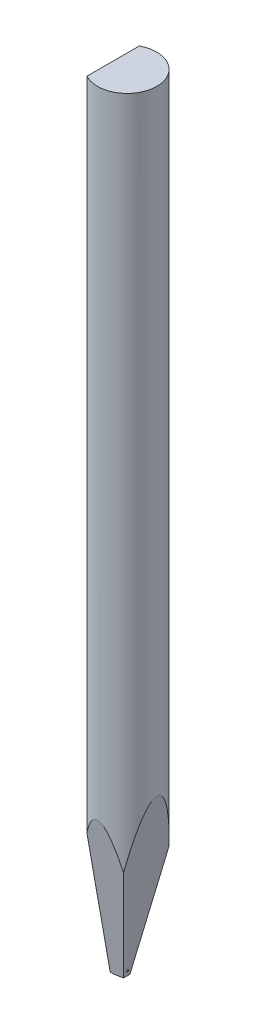
ISO-10303-21;
HEADER;
FILE_DESCRIPTION(('STEP AP214'),'2;1');
FILE_NAME('part.step','',(''),(''),'','','');
FILE_SCHEMA(('AUTOMOTIVE_DESIGN { 1 0 10303 214 1 1 1 1 }'));
ENDSEC;
DATA;
#1=APPLICATION_CONTEXT('core data for automotive mechanical design processes');
#2=APPLICATION_PROTOCOL_DEFINITION('international standard','automotive_design',2000,#1);
#3=PRODUCT_CONTEXT('',#1,'mechanical');
#4=PRODUCT('Part','Part','',(#3));
#5=PRODUCT_RELATED_PRODUCT_CATEGORY('part','',(#4));
#6=PRODUCT_DEFINITION_FORMATION('','',#4);
#7=PRODUCT_DEFINITION_CONTEXT('part definition',#1,'design');
#8=PRODUCT_DEFINITION('design','',#6,#7);
#9=PRODUCT_DEFINITION_SHAPE('','',#8);
#10=(LENGTH_UNIT() NAMED_UNIT(*) SI_UNIT(.MILLI.,.METRE.));
#11=(NAMED_UNIT(*) PLANE_ANGLE_UNIT() SI_UNIT($,.RADIAN.));
#12=(NAMED_UNIT(*) SI_UNIT($,.STERADIAN.) SOLID_ANGLE_UNIT());
#13=UNCERTAINTY_MEASURE_WITH_UNIT(LENGTH_MEASURE(1.E-05),#10,'distance_accuracy_value','');
#14=(GEOMETRIC_REPRESENTATION_CONTEXT(3) GLOBAL_UNCERTAINTY_ASSIGNED_CONTEXT((#13)) GLOBAL_UNIT_ASSIGNED_CONTEXT((#10,
#11,#12)) REPRESENTATION_CONTEXT('',''));
#15=CARTESIAN_POINT('',(0.,0.,0.));
#16=DIRECTION('',(0.,0.,1.));
#17=DIRECTION('',(1.,0.,0.));
#18=AXIS2_PLACEMENT_3D('',#15,#16,#17);
#19=CARTESIAN_POINT('',(0.,0.,0.));
#20=DIRECTION('',(0.,1.,0.));
#21=DIRECTION('',(0.,0.,1.));
#22=AXIS2_PLACEMENT_3D('',#19,#20,#21);
#23=PLANE('',#22);
#24=DIRECTION('',(-1.,0.,0.));
#25=VECTOR('',#24,1.);
#26=CARTESIAN_POINT('',(26.7786219491216,0.,0.0305592719154106));
#27=LINE('',#26,#25);
#28=CARTESIAN_POINT('',(-0.317710360796309,0.,0.0305770328086754));
#29=VERTEX_POINT('',#28);
#30=CARTESIAN_POINT('',(-0.375919999999998,0.,0.0305592719154106));
#31=VERTEX_POINT('',#30);
#32=EDGE_CURVE('E170',#29,#31,#27,.T.);
#33=ORIENTED_EDGE('',*,*,#32,.F.);
#34=CARTESIAN_POINT('',(-0.29972000002033,-1.74726357206605E-13,0.0322807752025751));
#35=CARTESIAN_POINT('',(-0.300686407289978,1.24223762482002E-08,0.0322152859431733));
#36=CARTESIAN_POINT('',(-0.301651821540009,9.7018723529701E-07,0.0321369955428288));
#37=CARTESIAN_POINT('',(-0.30351131031156,3.62214230492226E-06,0.0319666277855502));
#38=CARTESIAN_POINT('',(-0.304405511996895,5.25828560346504E-06,0.0318759506449385));
#39=CARTESIAN_POINT('',(-0.306127717271468,8.29289943810084E-06,0.0316886354981823));
#40=CARTESIAN_POINT('',(-0.306955822256389,9.70000125446796E-06,0.0315929056194708));
#41=CARTESIAN_POINT('',(-0.308550777856734,1.17772221327017E-05,0.0314033320937109));
#42=CARTESIAN_POINT('',(-0.309317674036299,1.24937582165023E-05,0.0313098635346038));
#43=CARTESIAN_POINT('',(-0.310794720526242,1.3053439983054E-05,0.0311320300678206));
#44=CARTESIAN_POINT('',(-0.311504850449402,1.29575626239236E-05,0.0310475049989768));
#45=CARTESIAN_POINT('',(-0.312872338996876,1.20754054263439E-05,0.0308945557940236));
#46=CARTESIAN_POINT('',(-0.313529614373576,1.13420495449805E-05,0.030825396668933));
#47=CARTESIAN_POINT('',(-0.314794854379422,9.57631192832601E-06,0.0307094686916388));
#48=CARTESIAN_POINT('',(-0.315402684866468,8.57157184484339E-06,0.0306613782169008));
#49=CARTESIAN_POINT('',(-0.316571417654933,6.9939604335059E-06,0.0305949486246632));
#50=CARTESIAN_POINT('',(-0.317132208614356,6.39310305501187E-06,0.0305745479993135));
#51=CARTESIAN_POINT('',(-0.317693589841151,6.21334656415781E-06,0.0305702414068889));
#52=B_SPLINE_CURVE_WITH_KNOTS('',3,(#34,#35,#36,#37,#38,#39,#40,#41,#42,#43,#44,#45,#46,#47,#48,
#49,#50,#51),.UNSPECIFIED.,.F.,.F.,(4,2,2,2,2,2,2,2,4),(0.,0.00290561022115357,
0.00560181967612335,0.0081026466662088,0.0104203684999723,0.0125657636721677,0.0145484144140113,
0.0163771098843251,0.0180604059657814),.UNSPECIFIED.);
#53=CARTESIAN_POINT('',(-0.29972,0.,0.032280775210277));
#54=VERTEX_POINT('',#53);
#55=EDGE_CURVE('E172',#29,#54,#52,.F.);
#56=ORIENTED_EDGE('',*,*,#55,.T.);
#57=DIRECTION('',(0.,0.,-1.));
#58=VECTOR('',#57,1.);
#59=CARTESIAN_POINT('',(-0.29972,0.,27.2760283406468));
#60=LINE('',#59,#58);
#61=CARTESIAN_POINT('',(-0.299719999999993,0.,0.0762000000000001));
#62=VERTEX_POINT('',#61);
#63=EDGE_CURVE('E220',#62,#54,#60,.T.);
#64=ORIENTED_EDGE('',*,*,#63,.F.);
#65=DIRECTION('',(-1.,0.,0.));
#66=VECTOR('',#65,1.);
#67=CARTESIAN_POINT('',(26.8738719491216,0.,0.0762));
#68=LINE('',#67,#66);
#69=CARTESIAN_POINT('',(-0.375919999999998,0.,0.0762));
#70=VERTEX_POINT('',#69);
#71=EDGE_CURVE('E240',#62,#70,#68,.T.);
#72=ORIENTED_EDGE('',*,*,#71,.T.);
#73=DIRECTION('',(0.,0.,1.));
#74=VECTOR('',#73,1.);
#75=CARTESIAN_POINT('',(-0.37592,0.,0.));
#76=LINE('',#75,#74);
#77=EDGE_CURVE('E186',#31,#70,#76,.T.);
#78=ORIENTED_EDGE('',*,*,#77,.F.);
#79=EDGE_LOOP('',(#33,#56,#64,#72,#78));
#80=FACE_BOUND('',#79,.T.);
#81=ADVANCED_FACE('F45',(#80),#23,.F.);
#82=CARTESIAN_POINT('',(-0.29972,0.,-0.032278111075059));
#83=VERTEX_POINT('',#82);
#84=CARTESIAN_POINT('',(-0.299719999999993,0.,-0.0762000000000001));
#85=VERTEX_POINT('',#84);
#86=EDGE_CURVE('E225',#83,#85,#60,.T.);
#87=ORIENTED_EDGE('',*,*,#86,.F.);
#88=CARTESIAN_POINT('',(-0.317682511652513,6.43790428013726E-06,-0.030570613507464));
#89=CARTESIAN_POINT('',(-0.317121273851713,6.6174722265185E-06,-0.0305750601274098));
#90=CARTESIAN_POINT('',(-0.316560631451084,7.18813768573643E-06,-0.0305955857376526));
#91=CARTESIAN_POINT('',(-0.315391703606004,8.67399681592602E-06,-0.0306622289088094));
#92=CARTESIAN_POINT('',(-0.314783530685761,9.61491344262969E-06,-0.0307104237525561));
#93=CARTESIAN_POINT('',(-0.313517269904021,1.12547805020148E-05,-0.0308264650915119));
#94=CARTESIAN_POINT('',(-0.312859315988159,1.19264963525961E-05,-0.0308956300361787));
#95=CARTESIAN_POINT('',(-0.311490375327924,1.27073946710848E-05,-0.0310484783755905));
#96=CARTESIAN_POINT('',(-0.310779470598419,1.27658516769523E-05,-0.0311328875999629));
#97=CARTESIAN_POINT('',(-0.309301129508577,1.21650146399189E-05,-0.0313103678796936));
#98=CARTESIAN_POINT('',(-0.308533712640017,1.14480252757793E-05,-0.0314035923196854));
#99=CARTESIAN_POINT('',(-0.306938462102202,9.40248633924498E-06,-0.0315925755252677));
#100=CARTESIAN_POINT('',(-0.306110583728908,8.03060699328291E-06,-0.0316879650252507));
#101=CARTESIAN_POINT('',(-0.304390252743759,5.08254953581124E-06,-0.0318745569032146));
#102=CARTESIAN_POINT('',(-0.303497702434909,3.49877090696116E-06,-0.0319648815459051));
#103=CARTESIAN_POINT('',(-0.301643840636724,9.37653295759017E-07,-0.032134581646994));
#104=CARTESIAN_POINT('',(-0.300682408000462,1.49043844381255E-08,-0.0322126220809699));
#105=CARTESIAN_POINT('',(-0.299720000145215,-1.28192946059671E-13,-0.0322781112703166));
#106=B_SPLINE_CURVE_WITH_KNOTS('',3,(#88,#89,#90,#91,#92,#93,#94,#95,#96,#97,#98,#99,#100,#101,
#102,#103,#104,#105),.UNSPECIFIED.,.F.,.F.,(4,2,2,2,2,2,2,2,4),(0.,0.00168286779229302,
0.00351261455278365,0.00549729447393092,0.00764495741405796,0.00996414130010328,
0.0124641762366295,0.015155354305918,0.0180490028825687),.UNSPECIFIED.);
#107=CARTESIAN_POINT('',(-0.317699619026821,0.,-0.0305592719154106));
#108=VERTEX_POINT('',#107);
#109=EDGE_CURVE('E75',#83,#108,#106,.F.);
#110=ORIENTED_EDGE('',*,*,#109,.T.);
#111=DIRECTION('',(-1.,0.,0.));
#112=VECTOR('',#111,1.);
#113=CARTESIAN_POINT('',(26.7786219491216,0.,-0.0305592719154106));
#114=LINE('',#113,#112);
#115=CARTESIAN_POINT('',(-0.375919999999998,0.,-0.0305592719154106));
#116=VERTEX_POINT('',#115);
#117=EDGE_CURVE('E169',#108,#116,#114,.T.);
#118=ORIENTED_EDGE('',*,*,#117,.T.);
#119=CARTESIAN_POINT('',(-0.37592,0.,-0.0762000000000005));
#120=VERTEX_POINT('',#119);
#121=EDGE_CURVE('E178',#120,#116,#76,.T.);
#122=ORIENTED_EDGE('',*,*,#121,.F.);
#123=DIRECTION('',(-1.,0.,0.));
#124=VECTOR('',#123,1.);
#125=CARTESIAN_POINT('',(26.8738719491216,0.,-0.0762));
#126=LINE('',#125,#124);
#127=EDGE_CURVE('E243',#85,#120,#126,.T.);
#128=ORIENTED_EDGE('',*,*,#127,.F.);
#129=EDGE_LOOP('',(#87,#110,#118,#122,#128));
#130=FACE_BOUND('',#129,.T.);
#131=ADVANCED_FACE('F176',(#130),#23,.F.);
#132=CARTESIAN_POINT('',(-0.29972,0.,27.2760283406468));
#133=DIRECTION('',(-0.173648177666931,0.984807753012208,0.));
#134=DIRECTION('',(-0.984807753012208,-0.173648177666931,0.));
#135=AXIS2_PLACEMENT_3D('',#132,#133,#134);
#136=PLANE('',#135);
#137=DIRECTION('',(-0.984807753012208,-0.173648177666931,0.));
#138=VECTOR('',#137,1.);
#139=CARTESIAN_POINT('',(-0.29972,0.,-0.0190499999999996));
#140=LINE('',#139,#138);
#141=CARTESIAN_POINT('',(-0.1397,0.0282158434529687,-0.0190499999999998));
#142=VERTEX_POINT('',#141);
#143=CARTESIAN_POINT('',(-0.172308434913934,0.0224660965789663,-0.01905));
#144=VERTEX_POINT('',#143);
#145=EDGE_CURVE('E206',#142,#144,#140,.T.);
#146=ORIENTED_EDGE('',*,*,#145,.T.);
#147=CARTESIAN_POINT('',(-0.172308434913934,0.0224660965789663,-0.04445));
#148=DIRECTION('',(-0.173648177666931,0.984807753012208,0.));
#149=DIRECTION('',(-0.984807753012208,-0.173648177666931,0.));
#150=AXIS2_PLACEMENT_3D('',#147,#148,#149);
#151=ELLIPSE('',#150,0.146272770271847,0.0254);
#152=CARTESIAN_POINT('',(-0.290152127752212,0.00168707402525674,-0.0298420493686051));
#153=VERTEX_POINT('',#152);
#154=EDGE_CURVE('E383',#144,#153,#151,.F.);
#155=ORIENTED_EDGE('',*,*,#154,.T.);
#156=CARTESIAN_POINT('',(-0.299720000129434,-2.28226443167289E-11,-0.0322781113175099));
#157=CARTESIAN_POINT('',(-0.299306160257967,4.4993723494889E-05,-0.0322150037200581));
#158=CARTESIAN_POINT('',(-0.298893426590026,9.30259749901382E-05,-0.0321467991132638));
#159=CARTESIAN_POINT('',(-0.298071445006129,0.000195204853066265,-0.0320004874666544));
#160=CARTESIAN_POINT('',(-0.297662191361852,0.000249337576544469,-0.0319224028955109));
#161=CARTESIAN_POINT('',(-0.296847443987139,0.000363834584556914,-0.0317565134529267));
#162=CARTESIAN_POINT('',(-0.296441944180107,0.000424185589633815,-0.0316687292676122));
#163=CARTESIAN_POINT('',(-0.295634969723986,0.000551243306116202,-0.0314836230901761));
#164=CARTESIAN_POINT('',(-0.295233488831756,0.000617937566250923,-0.0313863197729815));
#165=CARTESIAN_POINT('',(-0.294434807056674,0.000757812171341388,-0.0311823559027142));
#166=CARTESIAN_POINT('',(-0.294037599988075,0.000830981135403096,-0.0310757117716665));
#167=CARTESIAN_POINT('',(-0.29324771030769,0.000983942275247106,-0.0308532463080567));
#168=CARTESIAN_POINT('',(-0.292855021835243,0.0010637244178342,-0.0307374388892935));
#169=CARTESIAN_POINT('',(-0.292074402965838,0.00123005638345297,-0.0304968248930324));
#170=CARTESIAN_POINT('',(-0.291686467349433,0.001316597832869,-0.0303720294646064));
#171=CARTESIAN_POINT('',(-0.290915576771095,0.00149659903366281,-0.0301136222011364));
#172=CARTESIAN_POINT('',(-0.290532617598061,0.00159005241779613,-0.0299800184922692));
#173=CARTESIAN_POINT('',(-0.290152147836756,0.00168707325331096,-0.0298420504644946));
#174=B_SPLINE_CURVE_WITH_KNOTS('',3,(#156,#157,#158,#159,#160,#161,#162,#163,#164,#165,#166,
#167,#168,#169,#170,#171,#172,#173),.UNSPECIFIED.,.F.,.F.,(4,2,2,2,2,2,2,2,4),(0.,
0.00126306370365663,0.00252330495037774,0.00378090857781648,0.00503609267401743,
0.0062891127100991,0.0075402653493693,0.00878989188831975,0.0100383812804196),.UNSPECIFIED.);
#175=EDGE_CURVE('E274',#153,#83,#174,.F.);
#176=ORIENTED_EDGE('',*,*,#175,.T.);
#177=ORIENTED_EDGE('',*,*,#86,.T.);
#178=DIRECTION('',(0.984346441568213,0.173566836012845,-0.0306045161452665));
#179=VECTOR('',#178,1.);
#180=CARTESIAN_POINT('',(26.0298035813508,4.64260539659194,-0.894816592201888));
#181=LINE('',#180,#179);
#182=CARTESIAN_POINT('',(-0.0113543651851166,0.0508466417269886,-0.0851656348148851));
#183=VERTEX_POINT('',#182);
#184=EDGE_CURVE('E203',#85,#183,#181,.T.);
#185=ORIENTED_EDGE('',*,*,#184,.T.);
#186=DIRECTION('',(0.,0.,-1.));
#187=VECTOR('',#186,1.);
#188=CARTESIAN_POINT('',(-0.0113543651851151,0.0508466417269888,27.2760283406468));
#189=LINE('',#188,#187);
#190=CARTESIAN_POINT('',(-0.0113543651851166,0.0508466417269886,0.0851656348148851));
#191=VERTEX_POINT('',#190);
#192=EDGE_CURVE('E210',#191,#183,#189,.T.);
#193=ORIENTED_EDGE('',*,*,#192,.F.);
#194=DIRECTION('',(-0.984346441568213,-0.173566836012845,-0.0306045161452665));
#195=VECTOR('',#194,1.);
#196=CARTESIAN_POINT('',(26.0298035813508,4.64260539659194,0.894816592201888));
#197=LINE('',#196,#195);
#198=EDGE_CURVE('E237',#191,#62,#197,.T.);
#199=ORIENTED_EDGE('',*,*,#198,.T.);
#200=ORIENTED_EDGE('',*,*,#63,.T.);
#201=CARTESIAN_POINT('',(-0.290152147836355,0.00168707325874013,0.0298420504567719));
#202=CARTESIAN_POINT('',(-0.290534992923029,0.00159019384761207,0.0299798653538116));
#203=CARTESIAN_POINT('',(-0.29092025077928,0.00149680270494308,0.0301134265394838));
#204=CARTESIAN_POINT('',(-0.291695023548512,0.0013169325559799,0.0303717426179296));
#205=CARTESIAN_POINT('',(-0.292084535632163,0.00123044924002008,0.0304965029955968));
#206=CARTESIAN_POINT('',(-0.292867624137279,0.00106423142417858,0.0307370597268938));
#207=CARTESIAN_POINT('',(-0.293261199424063,0.00098449509444579,0.0308528585102666));
#208=CARTESIAN_POINT('',(-0.294052210187191,0.000831615269792872,0.0310753383402063));
#209=CARTESIAN_POINT('',(-0.294449645853234,0.000758472100692954,0.0311820189361579));
#210=CARTESIAN_POINT('',(-0.29524816357304,0.000618631412626729,0.0313861063147916));
#211=CARTESIAN_POINT('',(-0.295649246812102,0.000551936077230667,0.031483509955652));
#212=CARTESIAN_POINT('',(-0.296454836112643,0.000424851798958048,0.0316688863771004));
#213=CARTESIAN_POINT('',(-0.296859344067208,0.000364466628744461,0.0317568535167056));
#214=CARTESIAN_POINT('',(-0.297671549888011,0.000249870909783037,0.0319231974706844));
#215=CARTESIAN_POINT('',(-0.298079250105948,0.000195665484613924,0.0320015663311409));
#216=CARTESIAN_POINT('',(-0.298897598493603,9.33049104979823E-05,0.0321485545545423));
#217=CARTESIAN_POINT('',(-0.299308249259817,4.51560293286562E-05,0.0322171638269661));
#218=CARTESIAN_POINT('',(-0.299720000023017,-4.05862035810058E-12,0.0322807752102771));
#219=B_SPLINE_CURVE_WITH_KNOTS('',3,(#201,#202,#203,#204,#205,#206,#207,#208,#209,#210,#211,
#212,#213,#214,#215,#216,#217,#218),.UNSPECIFIED.,.F.,.F.,(4,2,2,2,2,2,2,2,4),(0.,
0.00125476226502894,0.00250873549119815,0.00376236752971127,0.00501606148617273,
0.00627017853188946,0.00752504113849814,0.00878093668996702,0.0100381214289372),.UNSPECIFIED.);
#220=CARTESIAN_POINT('',(-0.290152127709106,0.00168707403285748,0.0298420493552373));
#221=VERTEX_POINT('',#220);
#222=EDGE_CURVE('E219',#54,#221,#219,.F.);
#223=ORIENTED_EDGE('',*,*,#222,.T.);
#224=CARTESIAN_POINT('',(-0.172308434913934,0.0224660965789663,0.04445));
#225=DIRECTION('',(-0.173648177666931,0.984807753012208,0.));
#226=DIRECTION('',(-0.984807753012208,-0.173648177666931,0.));
#227=AXIS2_PLACEMENT_3D('',#224,#225,#226);
#228=ELLIPSE('',#227,0.146272770271847,0.0254);
#229=CARTESIAN_POINT('',(-0.172308434913934,0.0224660965789663,0.0190499999999998));
#230=VERTEX_POINT('',#229);
#231=EDGE_CURVE('E392',#221,#230,#228,.F.);
#232=ORIENTED_EDGE('',*,*,#231,.T.);
#233=DIRECTION('',(-0.984807753012208,-0.173648177666931,0.));
#234=VECTOR('',#233,1.);
#235=CARTESIAN_POINT('',(-0.29972,0.,0.0190499999999996));
#236=LINE('',#235,#234);
#237=CARTESIAN_POINT('',(-0.1397,0.0282158434529687,0.0190499999999998));
#238=VERTEX_POINT('',#237);
#239=EDGE_CURVE('E216',#238,#230,#236,.T.);
#240=ORIENTED_EDGE('',*,*,#239,.F.);
#241=DIRECTION('',(0.,0.,1.));
#242=VECTOR('',#241,1.);
#243=CARTESIAN_POINT('',(-0.1397,0.0282158434529687,27.2760283406468));
#244=LINE('',#243,#242);
#245=EDGE_CURVE('E214',#142,#238,#244,.T.);
#246=ORIENTED_EDGE('',*,*,#245,.F.);
#247=EDGE_LOOP('',(#146,#155,#176,#177,#185,#193,#199,#200,#223,#232,#240,#246));
#248=FACE_BOUND('',#247,.T.);
#249=ADVANCED_FACE('F416',(#248),#136,.F.);
#250=CARTESIAN_POINT('',(0.,21.0312,0.));
#251=DIRECTION('',(0.,-1.,0.));
#252=DIRECTION('',(0.,0.,-1.));
#253=AXIS2_PLACEMENT_3D('',#250,#251,#252);
#254=CYLINDRICAL_SURFACE('',#253,0.792479999999998);
#255=CARTESIAN_POINT('',(0.,-0.432151674654869,0.));
#256=DIRECTION('',(0.,-0.173648177666931,0.984807753012208));
#257=DIRECTION('',(0.,-0.984807753012208,-0.173648177666931));
#258=AXIS2_PLACEMENT_3D('',#255,#256,#257);
#259=ELLIPSE('',#258,4.56371043248163,0.792479999999998);
#260=CARTESIAN_POINT('',(0.510025990868476,3.00774157611953,0.606545990868479));
#261=VERTEX_POINT('',#260);
#262=CARTESIAN_POINT('',(-0.37592,3.52439037249585,0.69764511322018));
#263=VERTEX_POINT('',#262);
#264=EDGE_CURVE('E245',#261,#263,#259,.T.);
#265=ORIENTED_EDGE('',*,*,#264,.F.);
#266=CARTESIAN_POINT('',(0.,0.115240446574631,0.));
#267=DIRECTION('',(-0.984807753012208,0.173648177666931,0.));
#268=DIRECTION('',(-0.173648177666931,-0.984807753012208,0.));
#269=AXIS2_PLACEMENT_3D('',#266,#267,#268);
#270=ELLIPSE('',#269,4.56371043248165,0.792479999999998);
#271=CARTESIAN_POINT('',(0.510025990868476,3.00774157611953,-0.606545990868479));
#272=VERTEX_POINT('',#271);
#273=EDGE_CURVE('E224',#261,#272,#270,.T.);
#274=ORIENTED_EDGE('',*,*,#273,.T.);
#275=CARTESIAN_POINT('',(0.,-0.432151674654869,0.));
#276=DIRECTION('',(0.,-0.173648177666931,-0.984807753012208));
#277=DIRECTION('',(0.,-0.984807753012208,0.173648177666931));
#278=AXIS2_PLACEMENT_3D('',#275,#276,#277);
#279=ELLIPSE('',#278,4.56371043248163,0.792479999999998);
#280=CARTESIAN_POINT('',(-0.37592,3.52439037249585,-0.69764511322018));
#281=VERTEX_POINT('',#280);
#282=EDGE_CURVE('E247',#281,#272,#279,.T.);
#283=ORIENTED_EDGE('',*,*,#282,.F.);
#284=DIRECTION('',(0.,-1.,0.));
#285=VECTOR('',#284,1.);
#286=CARTESIAN_POINT('',(-0.37592,21.0312,-0.69764511322018));
#287=LINE('',#286,#285);
#288=CARTESIAN_POINT('',(-0.37592,21.0312,-0.69764511322018));
#289=VERTEX_POINT('',#288);
#290=EDGE_CURVE('E252',#289,#281,#287,.T.);
#291=ORIENTED_EDGE('',*,*,#290,.F.);
#292=CARTESIAN_POINT('',(0.,21.0312,0.));
#293=DIRECTION('',(0.,1.,0.));
#294=DIRECTION('',(0.,0.,1.));
#295=AXIS2_PLACEMENT_3D('',#292,#293,#294);
#296=CIRCLE('',#295,0.792479999999998);
#297=CARTESIAN_POINT('',(-0.37592,21.0312,0.69764511322018));
#298=VERTEX_POINT('',#297);
#299=EDGE_CURVE('E190',#298,#289,#296,.T.);
#300=ORIENTED_EDGE('',*,*,#299,.F.);
#301=DIRECTION('',(0.,-1.,0.));
#302=VECTOR('',#301,1.);
#303=CARTESIAN_POINT('',(-0.37592,21.0312,0.69764511322018));
#304=LINE('',#303,#302);
#305=EDGE_CURVE('E251',#263,#298,#304,.F.);
#306=ORIENTED_EDGE('',*,*,#305,.F.);
#307=EDGE_LOOP('',(#265,#274,#283,#291,#300,#306));
#308=FACE_BOUND('',#307,.T.);
#309=ADVANCED_FACE('F262',(#308),#254,.T.);
#310=CARTESIAN_POINT('',(-0.37592,21.0312,-0.80247998));
#311=DIRECTION('',(-1.,0.,0.));
#312=DIRECTION('',(0.,0.,1.));
#313=AXIS2_PLACEMENT_3D('',#310,#311,#312);
#314=PLANE('',#313);
#315=ORIENTED_EDGE('',*,*,#121,.T.);
#316=CARTESIAN_POINT('',(-0.37592,0.,0.0305592719154106));
#317=CARTESIAN_POINT('',(-0.37592,0.0146958072941779,0.023773050294587));
#318=CARTESIAN_POINT('',(-0.37592,0.0292100000000017,0.0123620164096919));
#319=CARTESIAN_POINT('',(-0.37592,0.0292100000000017,-0.0123620164096919));
#320=CARTESIAN_POINT('',(-0.37592,0.014695807294178,-0.0237730502945872));
#321=CARTESIAN_POINT('',(-0.37592,0.,-0.0305592719154106));
#322=(BOUNDED_CURVE() B_SPLINE_CURVE(3,(#316,#317,#318,#319,#320,#321),.UNSPECIFIED.,.F.,
.F.) B_SPLINE_CURVE_WITH_KNOTS((4,2,4),(1.32272489561682,1.5707963267949,1.81886775797297),
.UNSPECIFIED.) CURVE() GEOMETRIC_REPRESENTATION_ITEM() RATIONAL_B_SPLINE_CURVE((1.,1.,1.,1.,1.,1.)) REPRESENTATION_ITEM(''));
#323=EDGE_CURVE('E12',#116,#31,#322,.F.);
#324=ORIENTED_EDGE('',*,*,#323,.T.);
#325=ORIENTED_EDGE('',*,*,#77,.T.);
#326=DIRECTION('',(0.,0.984807753012208,0.173648177666931));
#327=VECTOR('',#326,1.);
#328=CARTESIAN_POINT('',(-0.37592,20.2467685967878,3.64625157577457));
#329=LINE('',#328,#327);
#330=EDGE_CURVE('E185',#70,#263,#329,.T.);
#331=ORIENTED_EDGE('',*,*,#330,.T.);
#332=ORIENTED_EDGE('',*,*,#305,.T.);
#333=DIRECTION('',(0.,0.,-1.));
#334=VECTOR('',#333,1.);
#335=CARTESIAN_POINT('',(-0.37592,21.0312,-0.80247998));
#336=LINE('',#335,#334);
#337=EDGE_CURVE('E249',#298,#289,#336,.T.);
#338=ORIENTED_EDGE('',*,*,#337,.T.);
#339=ORIENTED_EDGE('',*,*,#290,.T.);
#340=DIRECTION('',(0.,-0.984807753012208,0.173648177666931));
#341=VECTOR('',#340,1.);
#342=CARTESIAN_POINT('',(-0.37592,20.5212329145634,-3.69464704024015));
#343=LINE('',#342,#341);
#344=EDGE_CURVE('E184',#281,#120,#343,.T.);
#345=ORIENTED_EDGE('',*,*,#344,.T.);
#346=EDGE_LOOP('',(#315,#324,#325,#331,#332,#338,#339,#345));
#347=FACE_BOUND('',#346,.T.);
#348=ADVANCED_FACE('F182',(#347),#314,.T.);
#349=CARTESIAN_POINT('',(0.,21.0312,0.));
#350=DIRECTION('',(0.,1.,0.));
#351=DIRECTION('',(0.,0.,1.));
#352=AXIS2_PLACEMENT_3D('',#349,#350,#351);
#353=PLANE('',#352);
#354=ORIENTED_EDGE('',*,*,#299,.T.);
#355=ORIENTED_EDGE('',*,*,#337,.F.);
#356=EDGE_LOOP('',(#354,#355));
#357=FACE_BOUND('',#356,.T.);
#358=ADVANCED_FACE('F258',(#357),#353,.T.);
#359=CARTESIAN_POINT('',(26.8738719491216,0.,0.0762));
#360=DIRECTION('',(0.,-0.173648177666931,0.984807753012208));
#361=DIRECTION('',(0.,-0.984807753012208,-0.173648177666931));
#362=AXIS2_PLACEMENT_3D('',#359,#360,#361);
#363=PLANE('',#362);
#364=ORIENTED_EDGE('',*,*,#198,.F.);
#365=DIRECTION('',(-0.171087869746036,-0.970287525247814,-0.171087869746036));
#366=VECTOR('',#365,1.);
#367=CARTESIAN_POINT('',(0.766901483986011,4.46455489014234,0.863421483986016));
#368=LINE('',#367,#366);
#369=EDGE_CURVE('E234',#261,#191,#368,.T.);
#370=ORIENTED_EDGE('',*,*,#369,.F.);
#371=ORIENTED_EDGE('',*,*,#264,.T.);
#372=ORIENTED_EDGE('',*,*,#330,.F.);
#373=ORIENTED_EDGE('',*,*,#71,.F.);
#374=EDGE_LOOP('',(#364,#370,#371,#372,#373));
#375=FACE_BOUND('',#374,.T.);
#376=ADVANCED_FACE('F497',(#375),#363,.T.);
#377=CARTESIAN_POINT('',(26.8738719491216,0.,-0.0762));
#378=DIRECTION('',(0.,-0.173648177666931,-0.984807753012208));
#379=DIRECTION('',(0.,0.984807753012208,-0.173648177666931));
#380=AXIS2_PLACEMENT_3D('',#377,#378,#379);
#381=PLANE('',#380);
#382=ORIENTED_EDGE('',*,*,#184,.F.);
#383=ORIENTED_EDGE('',*,*,#127,.T.);
#384=ORIENTED_EDGE('',*,*,#344,.F.);
#385=ORIENTED_EDGE('',*,*,#282,.T.);
#386=DIRECTION('',(0.171087869746036,0.970287525247814,-0.171087869746036));
#387=VECTOR('',#386,1.);
#388=CARTESIAN_POINT('',(0.766901483986011,4.46455489014234,-0.863421483986016));
#389=LINE('',#388,#387);
#390=EDGE_CURVE('E200',#183,#272,#389,.T.);
#391=ORIENTED_EDGE('',*,*,#390,.F.);
#392=EDGE_LOOP('',(#382,#383,#384,#385,#391));
#393=FACE_BOUND('',#392,.T.);
#394=ADVANCED_FACE('F267',(#393),#381,.T.);
#395=CARTESIAN_POINT('',(-0.0113543651851151,0.0508466417269888,27.2760283406468));
#396=DIRECTION('',(-0.984807753012208,0.173648177666931,0.));
#397=DIRECTION('',(-0.173648177666931,-0.984807753012208,0.));
#398=AXIS2_PLACEMENT_3D('',#395,#396,#397);
#399=PLANE('',#398);
#400=CARTESIAN_POINT('',(0.0122922911853769,0.184953494095707,0.));
#401=DIRECTION('',(-0.984807753012208,0.173648177666931,0.));
#402=DIRECTION('',(0.173648177666931,0.984807753012208,0.));
#403=AXIS2_PLACEMENT_3D('',#400,#401,#402);
#404=ELLIPSE('',#403,0.0336182099567053,0.0252651922242437);
#405=CARTESIAN_POINT('',(0.0181300320807831,0.218060967903463,0.));
#406=VERTEX_POINT('',#405);
#407=EDGE_CURVE('E207',#406,#406,#404,.F.);
#408=ORIENTED_EDGE('',*,*,#407,.F.);
#409=EDGE_LOOP('',(#408));
#410=FACE_BOUND('',#409,.T.);
#411=ORIENTED_EDGE('',*,*,#273,.F.);
#412=ORIENTED_EDGE('',*,*,#369,.T.);
#413=ORIENTED_EDGE('',*,*,#192,.T.);
#414=ORIENTED_EDGE('',*,*,#390,.T.);
#415=EDGE_LOOP('',(#411,#412,#413,#414));
#416=FACE_BOUND('',#415,.T.);
#417=ADVANCED_FACE('F489',(#410,#416),#399,.F.);
#418=CARTESIAN_POINT('',(-0.1397,0.09144,0.01905));
#419=DIRECTION('',(-1.,0.,0.));
#420=DIRECTION('',(0.,-1.,0.));
#421=AXIS2_PLACEMENT_3D('',#418,#419,#420);
#422=PLANE('',#421);
#423=ORIENTED_EDGE('',*,*,#245,.T.);
#424=DIRECTION('',(0.,1.,0.));
#425=VECTOR('',#424,1.);
#426=CARTESIAN_POINT('',(-0.1397,0.09144,0.01905));
#427=LINE('',#426,#425);
#428=CARTESIAN_POINT('',(-0.1397,0.09144,0.01905));
#429=VERTEX_POINT('',#428);
#430=EDGE_CURVE('E444',#238,#429,#427,.T.);
#431=ORIENTED_EDGE('',*,*,#430,.T.);
#432=CARTESIAN_POINT('',(-0.1397,0.0914400000000001,0.));
#433=DIRECTION('',(1.,0.,0.));
#434=DIRECTION('',(0.,1.,0.));
#435=AXIS2_PLACEMENT_3D('',#432,#433,#434);
#436=ELLIPSE('',#435,0.0219970452561247,0.01905);
#437=CARTESIAN_POINT('',(-0.1397,0.09144,-0.0190499999999996));
#438=VERTEX_POINT('',#437);
#439=EDGE_CURVE('E437',#438,#429,#436,.F.);
#440=ORIENTED_EDGE('',*,*,#439,.F.);
#441=DIRECTION('',(0.,1.,0.));
#442=VECTOR('',#441,1.);
#443=CARTESIAN_POINT('',(-0.1397,0.09144,-0.01905));
#444=LINE('',#443,#442);
#445=EDGE_CURVE('E445',#142,#438,#444,.T.);
#446=ORIENTED_EDGE('',*,*,#445,.F.);
#447=EDGE_LOOP('',(#423,#431,#440,#446));
#448=FACE_BOUND('',#447,.T.);
#449=ADVANCED_FACE('F492',(#448),#422,.T.);
#450=CARTESIAN_POINT('',(0.,0.,0.01905));
#451=DIRECTION('',(0.,0.,-1.));
#452=DIRECTION('',(-1.,0.,0.));
#453=AXIS2_PLACEMENT_3D('',#450,#451,#452);
#454=PLANE('',#453);
#455=ORIENTED_EDGE('',*,*,#239,.T.);
#456=DIRECTION('',(1.,0.,0.));
#457=VECTOR('',#456,1.);
#458=CARTESIAN_POINT('',(-0.301769962417407,0.0224660965789663,0.01905));
#459=LINE('',#458,#457);
#460=CARTESIAN_POINT('',(-0.290152147836365,0.0224660965789732,0.01905));
#461=VERTEX_POINT('',#460);
#462=EDGE_CURVE('E390',#230,#461,#459,.F.);
#463=ORIENTED_EDGE('',*,*,#462,.T.);
#464=DIRECTION('',(-0.500000000000004,-0.866025403784436,0.));
#465=VECTOR('',#464,1.);
#466=CARTESIAN_POINT('',(-0.227342216057905,0.131256089639199,0.01905));
#467=LINE('',#466,#465);
#468=CARTESIAN_POINT('',(-0.250330046129175,0.09144,0.01905));
#469=VERTEX_POINT('',#468);
#470=EDGE_CURVE('E447',#469,#461,#467,.T.);
#471=ORIENTED_EDGE('',*,*,#470,.F.);
#472=DIRECTION('',(-1.,0.,0.));
#473=VECTOR('',#472,1.);
#474=CARTESIAN_POINT('',(-0.2723270913853,0.09144,0.01905));
#475=LINE('',#474,#473);
#476=EDGE_CURVE('E441',#429,#469,#475,.T.);
#477=ORIENTED_EDGE('',*,*,#476,.F.);
#478=ORIENTED_EDGE('',*,*,#430,.F.);
#479=EDGE_LOOP('',(#455,#463,#471,#477,#478));
#480=FACE_BOUND('',#479,.T.);
#481=ADVANCED_FACE('F609',(#480),#454,.T.);
#482=CARTESIAN_POINT('',(0.,0.,-0.01905));
#483=DIRECTION('',(0.,0.,-1.));
#484=DIRECTION('',(-1.,0.,0.));
#485=AXIS2_PLACEMENT_3D('',#482,#483,#484);
#486=PLANE('',#485);
#487=DIRECTION('',(0.500000000000004,0.866025403784436,0.));
#488=VECTOR('',#487,1.);
#489=CARTESIAN_POINT('',(-0.250330046129175,0.09144,-0.01905));
#490=LINE('',#489,#488);
#491=CARTESIAN_POINT('',(-0.290152147836481,0.0224660965787719,-0.01905));
#492=VERTEX_POINT('',#491);
#493=CARTESIAN_POINT('',(-0.250330046129175,0.09144,-0.01905));
#494=VERTEX_POINT('',#493);
#495=EDGE_CURVE('E458',#492,#494,#490,.T.);
#496=ORIENTED_EDGE('',*,*,#495,.F.);
#497=DIRECTION('',(-1.,0.,0.));
#498=VECTOR('',#497,1.);
#499=CARTESIAN_POINT('',(0.,0.0224660965789663,-0.01905));
#500=LINE('',#499,#498);
#501=EDGE_CURVE('E384',#492,#144,#500,.F.);
#502=ORIENTED_EDGE('',*,*,#501,.T.);
#503=ORIENTED_EDGE('',*,*,#145,.F.);
#504=ORIENTED_EDGE('',*,*,#445,.T.);
#505=DIRECTION('',(-1.,0.,0.));
#506=VECTOR('',#505,1.);
#507=CARTESIAN_POINT('',(-0.2723270913853,0.09144,-0.01905));
#508=LINE('',#507,#506);
#509=EDGE_CURVE('E440',#438,#494,#508,.T.);
#510=ORIENTED_EDGE('',*,*,#509,.T.);
#511=EDGE_LOOP('',(#496,#502,#503,#504,#510));
#512=FACE_BOUND('',#511,.T.);
#513=ADVANCED_FACE('F615',(#512),#486,.F.);
#514=CARTESIAN_POINT('',(-0.0103574919504674,0.166115931840058,0.));
#515=DIRECTION('',(0.866025403784441,0.499999999999995,0.));
#516=DIRECTION('',(-0.499999999999995,0.866025403784441,0.));
#517=AXIS2_PLACEMENT_3D('',#514,#515,#516);
#518=CONICAL_SURFACE('',#517,0.01905,0.226892802759263);
#519=CARTESIAN_POINT('',(-0.0103574919504674,0.166115931840058,0.));
#520=DIRECTION('',(0.866025403784441,0.499999999999995,0.));
#521=DIRECTION('',(-0.499999999999995,0.866025403784441,0.));
#522=AXIS2_PLACEMENT_3D('',#519,#520,#521);
#523=CIRCLE('',#522,0.01905);
#524=CARTESIAN_POINT('',(-0.0198824919504673,0.182613715782152,0.));
#525=VERTEX_POINT('',#524);
#526=EDGE_CURVE('E179',#525,#525,#523,.T.);
#527=ORIENTED_EDGE('',*,*,#526,.F.);
#528=EDGE_LOOP('',(#527));
#529=FACE_BOUND('',#528,.T.);
#530=ORIENTED_EDGE('',*,*,#407,.T.);
#531=EDGE_LOOP('',(#530));
#532=FACE_BOUND('',#531,.T.);
#533=ADVANCED_FACE('F487',(#529,#532),#518,.F.);
#534=CARTESIAN_POINT('',(-0.250330046129175,0.09144,0.));
#535=DIRECTION('',(-0.500000000000004,-0.866025403784436,0.));
#536=DIRECTION('',(0.866025403784436,-0.500000000000004,0.));
#537=AXIS2_PLACEMENT_3D('',#534,#535,#536);
#538=CYLINDRICAL_SURFACE('',#537,0.01905);
#539=ORIENTED_EDGE('',*,*,#470,.T.);
#540=CARTESIAN_POINT('',(-0.290152147836625,0.0224660965788552,-0.01905));
#541=CARTESIAN_POINT('',(-0.297136041320394,0.0194426602002142,-0.0190499999999603));
#542=CARTESIAN_POINT('',(-0.303430529699556,0.0177154111222197,-0.0174428781140795));
#543=CARTESIAN_POINT('',(-0.312722216728686,0.0163172935997035,-0.0107787205735705));
#544=CARTESIAN_POINT('',(-0.315592491755208,0.0165099676236247,-0.00544290008104461));
#545=CARTESIAN_POINT('',(-0.315583391121837,0.0165100321258386,0.00547030282652373));
#546=CARTESIAN_POINT('',(-0.312697438354562,0.0163214782827791,0.0107951190940624));
#547=CARTESIAN_POINT('',(-0.303461555603247,0.0177102875155549,0.017421997452442));
#548=CARTESIAN_POINT('',(-0.297248770822033,0.0193934736765432,0.0190500000000014));
#549=CARTESIAN_POINT('',(-0.29015214783636,0.0224660965789702,0.01905));
#550=(BOUNDED_CURVE() B_SPLINE_CURVE(3,(#540,#541,#542,#543,#544,#545,#546,#547,#548,#549),
.UNSPECIFIED.,.F.,.F.) B_SPLINE_CURVE_WITH_KNOTS((4,2,2,2,4),(-6.03867807661277E-06,
1.2761401311368E-05,3.15614806993489E-05,5.03615600873297E-05,6.91616394753105E-05),
.UNSPECIFIED.) CURVE() GEOMETRIC_REPRESENTATION_ITEM() RATIONAL_B_SPLINE_CURVE((1.,1.,1.,1.,1.,
1.,1.,1.,1.,1.)) REPRESENTATION_ITEM(''));
#551=EDGE_CURVE('E278',#461,#492,#550,.F.);
#552=ORIENTED_EDGE('',*,*,#551,.T.);
#553=ORIENTED_EDGE('',*,*,#495,.T.);
#554=CARTESIAN_POINT('',(-0.250330046129175,0.09144,0.));
#555=DIRECTION('',(0.,-1.,0.));
#556=DIRECTION('',(-1.,0.,0.));
#557=AXIS2_PLACEMENT_3D('',#554,#555,#556);
#558=ELLIPSE('',#557,0.0219970452561248,0.01905);
#559=EDGE_CURVE('E211',#494,#469,#558,.F.);
#560=ORIENTED_EDGE('',*,*,#559,.T.);
#561=EDGE_LOOP('',(#539,#552,#553,#560));
#562=FACE_BOUND('',#561,.T.);
#563=ADVANCED_FACE('F474',(#562),#538,.F.);
#564=CARTESIAN_POINT('',(-0.2723270913853,0.09144,0.01905));
#565=DIRECTION('',(0.,-1.,0.));
#566=DIRECTION('',(0.,0.,-1.));
#567=AXIS2_PLACEMENT_3D('',#564,#565,#566);
#568=PLANE('',#567);
#569=ORIENTED_EDGE('',*,*,#509,.F.);
#570=CARTESIAN_POINT('',(-0.1397,0.09144,0.));
#571=DIRECTION('',(0.,1.,0.));
#572=DIRECTION('',(1.,0.,0.));
#573=AXIS2_PLACEMENT_3D('',#570,#571,#572);
#574=ELLIPSE('',#573,0.0381000000000004,0.01905);
#575=EDGE_CURVE('E434',#429,#438,#574,.F.);
#576=ORIENTED_EDGE('',*,*,#575,.F.);
#577=ORIENTED_EDGE('',*,*,#476,.T.);
#578=ORIENTED_EDGE('',*,*,#559,.F.);
#579=EDGE_LOOP('',(#569,#576,#577,#578));
#580=FACE_BOUND('',#579,.T.);
#581=ADVANCED_FACE('F486',(#580),#568,.T.);
#582=CARTESIAN_POINT('',(-0.36807289524413,-0.0404111525448111,0.));
#583=DIRECTION('',(0.866025403784441,0.499999999999995,0.));
#584=DIRECTION('',(-0.499999999999995,0.866025403784441,0.));
#585=AXIS2_PLACEMENT_3D('',#582,#583,#584);
#586=CYLINDRICAL_SURFACE('',#585,0.01905);
#587=ORIENTED_EDGE('',*,*,#439,.T.);
#588=ORIENTED_EDGE('',*,*,#575,.T.);
#589=EDGE_LOOP('',(#587,#588));
#590=FACE_BOUND('',#589,.T.);
#591=ORIENTED_EDGE('',*,*,#526,.T.);
#592=EDGE_LOOP('',(#591));
#593=FACE_BOUND('',#592,.T.);
#594=ADVANCED_FACE('F641',(#590,#593),#586,.F.);
#595=CARTESIAN_POINT('',(26.7786219491216,-0.12065,0.));
#596=DIRECTION('',(-1.,0.,0.));
#597=DIRECTION('',(0.,0.,1.));
#598=AXIS2_PLACEMENT_3D('',#595,#596,#597);
#599=CYLINDRICAL_SURFACE('',#598,0.12446);
#600=ORIENTED_EDGE('',*,*,#32,.T.);
#601=CARTESIAN_POINT('',(-0.37592,0.,-0.0305592719154106));
#602=CARTESIAN_POINT('',(-0.363216800126761,0.00252588537008308,-0.0205869116201758));
#603=CARTESIAN_POINT('',(-0.35052,0.00381000000000001,-0.0102906602127608));
#604=CARTESIAN_POINT('',(-0.35052,0.00381000000000001,0.0102906602127608));
#605=CARTESIAN_POINT('',(-0.363216800126761,0.0025258853700831,0.0205869116201757));
#606=CARTESIAN_POINT('',(-0.37592,0.,0.0305592719154106));
#607=(BOUNDED_CURVE() B_SPLINE_CURVE(3,(#601,#602,#603,#604,#605,#606),.UNSPECIFIED.,.F.,
.F.) B_SPLINE_CURVE_WITH_KNOTS((4,2,4),(1.32272489561682,1.5707963267949,1.81886775797297),
.UNSPECIFIED.) CURVE() GEOMETRIC_REPRESENTATION_ITEM() RATIONAL_B_SPLINE_CURVE((1.,1.,1.,1.,1.,1.)) REPRESENTATION_ITEM(''));
#608=EDGE_CURVE('E59',#31,#116,#607,.F.);
#609=ORIENTED_EDGE('',*,*,#608,.T.);
#610=ORIENTED_EDGE('',*,*,#117,.F.);
#611=CARTESIAN_POINT('',(-0.290152147836353,-0.00179086894289244,0.0369161016949153));
#612=CARTESIAN_POINT('',(-0.302520258200328,-0.00179064889812772,0.0369153932146495));
#613=CARTESIAN_POINT('',(-0.314026684178617,-0.000676168678519454,0.0337625121859154));
#614=CARTESIAN_POINT('',(-0.33169364339382,0.00221602420737359,0.0209181147939422));
#615=CARTESIAN_POINT('',(-0.337575348539334,0.003807741380202,0.0106006429837389));
#616=CARTESIAN_POINT('',(-0.337594613471001,0.00381225295557848,-0.0105475404882625));
#617=CARTESIAN_POINT('',(-0.331741065476307,0.00222335789035263,-0.0208866229668283));
#618=CARTESIAN_POINT('',(-0.313967309124781,-0.000685458304263606,-0.0338026897441757));
#619=CARTESIAN_POINT('',(-0.302313604837971,-0.00179023387073148,-0.0369140569469121));
#620=CARTESIAN_POINT('',(-0.290152147836818,-0.00179086894289241,-0.0369161016949153));
#621=(BOUNDED_CURVE() B_SPLINE_CURVE(3,(#611,#612,#613,#614,#615,#616,#617,#618,#619,#620),
.UNSPECIFIED.,.F.,.F.) B_SPLINE_CURVE_WITH_KNOTS((4,2,2,2,4),(-6.03867807661277E-06,
1.2761401311368E-05,3.15614806993489E-05,5.03615600873297E-05,6.91616394753105E-05),
.UNSPECIFIED.) CURVE() GEOMETRIC_REPRESENTATION_ITEM() RATIONAL_B_SPLINE_CURVE((1.,1.,1.,1.,1.,
1.,1.,1.,1.,1.)) REPRESENTATION_ITEM(''));
#622=EDGE_CURVE('E66',#108,#29,#621,.F.);
#623=ORIENTED_EDGE('',*,*,#622,.T.);
#624=EDGE_LOOP('',(#600,#609,#610,#623));
#625=FACE_BOUND('',#624,.T.);
#626=ADVANCED_FACE('F168',(#625),#599,.F.);
#627=CARTESIAN_POINT('',(26.7786219491216,0.0224660965789663,-0.04445));
#628=DIRECTION('',(-1.,0.,0.));
#629=DIRECTION('',(0.,0.,1.));
#630=AXIS2_PLACEMENT_3D('',#627,#628,#629);
#631=CYLINDRICAL_SURFACE('',#630,0.0254);
#632=ORIENTED_EDGE('',*,*,#154,.F.);
#633=ORIENTED_EDGE('',*,*,#501,.F.);
#634=CARTESIAN_POINT('',(-0.290152147836818,-0.00179086894289241,-0.0369161016949153));
#635=CARTESIAN_POINT('',(-0.290152147836669,0.00375811009803025,-0.0190500000000818));
#636=CARTESIAN_POINT('',(-0.290152147836625,0.0224660965788552,-0.01905));
#637=(BOUNDED_CURVE() B_SPLINE_CURVE(2,(#634,#635,#636),.UNSPECIFIED.,.F.,
.F.) B_SPLINE_CURVE_WITH_KNOTS((3,3),(0.,1.),
.UNSPECIFIED.) CURVE() GEOMETRIC_REPRESENTATION_ITEM() RATIONAL_B_SPLINE_CURVE((1.,
0.805173946888405,1.)) REPRESENTATION_ITEM(''));
#638=EDGE_CURVE('E382',#153,#492,#637,.T.);
#639=ORIENTED_EDGE('',*,*,#638,.F.);
#640=EDGE_LOOP('',(#632,#633,#639));
#641=FACE_BOUND('',#640,.T.);
#642=ADVANCED_FACE('F302',(#641),#631,.T.);
#643=CARTESIAN_POINT('',(-0.29015214783636,0.0224660965789702,0.01905));
#644=CARTESIAN_POINT('',(-0.297248770822033,0.0193934736765432,0.0190500000000014));
#645=CARTESIAN_POINT('',(-0.303461555603247,0.0177102875155549,0.017421997452442));
#646=CARTESIAN_POINT('',(-0.312697438354562,0.0163214782827791,0.0107951190940624));
#647=CARTESIAN_POINT('',(-0.315583391121837,0.0165100321258386,0.00547030282652373));
#648=CARTESIAN_POINT('',(-0.315592491755208,0.0165099676236247,-0.00544290008104461));
#649=CARTESIAN_POINT('',(-0.312722216728686,0.0163172935997035,-0.0107787205735705));
#650=CARTESIAN_POINT('',(-0.303430529699556,0.0177154111222197,-0.0174428781140795));
#651=CARTESIAN_POINT('',(-0.297136041320394,0.0194426602002142,-0.0190499999999603));
#652=CARTESIAN_POINT('',(-0.290152147836625,0.0224660965788552,-0.01905));
#653=CARTESIAN_POINT('',(-0.290152147836358,0.00375811009805654,0.0190499999999971));
#654=CARTESIAN_POINT('',(-0.298145292711057,0.00308209661115871,0.0212230924015317));
#655=CARTESIAN_POINT('',(-0.306755500822175,0.00297321410603349,0.0202384836186548));
#656=CARTESIAN_POINT('',(-0.319044297767278,0.00342052942303611,0.0129233548185472));
#657=CARTESIAN_POINT('',(-0.32291399124179,0.00380947237587074,0.00645947428464586));
#658=CARTESIAN_POINT('',(-0.322926584973749,0.00381052638936928,-0.00642716350322973));
#659=CARTESIAN_POINT('',(-0.319076839958157,0.00342154649470788,-0.0129061133984163));
#660=CARTESIAN_POINT('',(-0.306713527471348,0.00297185539488627,-0.0202613068144416));
#661=CARTESIAN_POINT('',(-0.298018226266409,0.00309305891905859,-0.0211872168866173));
#662=CARTESIAN_POINT('',(-0.290152147836669,0.00375811009803025,-0.0190500000000818));
#663=CARTESIAN_POINT('',(-0.290152147836353,-0.00179086894289244,0.0369161016949153));
#664=CARTESIAN_POINT('',(-0.302520258200328,-0.00179064889812772,0.0369153932146495));
#665=CARTESIAN_POINT('',(-0.314026684178617,-0.000676168678519454,0.0337625121859154));
#666=CARTESIAN_POINT('',(-0.33169364339382,0.00221602420737359,0.0209181147939422));
#667=CARTESIAN_POINT('',(-0.337575348539334,0.003807741380202,0.0106006429837389));
#668=CARTESIAN_POINT('',(-0.337594613471001,0.00381225295557848,-0.0105475404882625));
#669=CARTESIAN_POINT('',(-0.331741065476307,0.00222335789035263,-0.0208866229668283));
#670=CARTESIAN_POINT('',(-0.313967309124781,-0.000685458304263606,-0.0338026897441757));
#671=CARTESIAN_POINT('',(-0.302313604837971,-0.00179023387073148,-0.0369140569469121));
#672=CARTESIAN_POINT('',(-0.290152147836818,-0.00179086894289241,-0.0369161016949153));
#673=(BOUNDED_SURFACE() B_SPLINE_SURFACE(2,3,((#643,#644,#645,#646,#647,#648,#649,#650,#651,
#652),(#653,#654,#655,#656,#657,#658,#659,#660,#661,#662),(#663,#664,#665,#666,#667,#668,#669,
#670,#671,#672)),.UNSPECIFIED.,.F.,.F.,.F.) B_SPLINE_SURFACE_WITH_KNOTS((3,3),(4,2,2,2,4),(0.,
1.),(-6.03867807661277E-06,1.2761401311368E-05,3.15614806993489E-05,5.03615600873297E-05,
6.91616394753105E-05),
.UNSPECIFIED.) GEOMETRIC_REPRESENTATION_ITEM() RATIONAL_B_SPLINE_SURFACE(((1.,1.,1.,1.,1.,1.,1.,
1.,1.,1.),(0.805173946887061,0.84114488434623,0.857171771779744,0.869358350342971,
0.866028507753438,0.866022307167165,0.869395483549706,0.857126408301957,0.8406805576456,
0.805173946888405),(1.,1.,1.,1.,1.,1.,1.,1.,1.,1.))) REPRESENTATION_ITEM('') SURFACE());
#674=CARTESIAN_POINT('',(-0.29015214783636,0.0224660965789702,0.01905));
#675=CARTESIAN_POINT('',(-0.290152147836358,0.00375811009805654,0.0190499999999971));
#676=CARTESIAN_POINT('',(-0.290152147836353,-0.00179086894289244,0.0369161016949153));
#677=(BOUNDED_CURVE() B_SPLINE_CURVE(2,(#674,#675,#676),.UNSPECIFIED.,.F.,
.F.) B_SPLINE_CURVE_WITH_KNOTS((3,3),(0.,1.),
.UNSPECIFIED.) CURVE() GEOMETRIC_REPRESENTATION_ITEM() RATIONAL_B_SPLINE_CURVE((1.,
0.805173946887061,1.)) REPRESENTATION_ITEM(''));
#678=EDGE_CURVE('E385',#221,#461,#677,.F.);
#679=ORIENTED_EDGE('',*,*,#638,.T.);
#680=ORIENTED_EDGE('',*,*,#551,.F.);
#681=ORIENTED_EDGE('',*,*,#678,.F.);
#682=ORIENTED_EDGE('',*,*,#222,.F.);
#683=ORIENTED_EDGE('',*,*,#55,.F.);
#684=ORIENTED_EDGE('',*,*,#622,.F.);
#685=ORIENTED_EDGE('',*,*,#109,.F.);
#686=ORIENTED_EDGE('',*,*,#175,.F.);
#687=EDGE_LOOP('',(#679,#680,#681,#682,#683,#684,#685,#686));
#688=FACE_BOUND('',#687,.T.);
#689=ADVANCED_FACE('F273',(#688),#673,.T.);
#690=CARTESIAN_POINT('',(26.7786219491216,0.0224660965789663,0.04445));
#691=DIRECTION('',(-1.,0.,0.));
#692=DIRECTION('',(0.,0.,1.));
#693=AXIS2_PLACEMENT_3D('',#690,#691,#692);
#694=CYLINDRICAL_SURFACE('',#693,0.0254);
#695=ORIENTED_EDGE('',*,*,#678,.T.);
#696=ORIENTED_EDGE('',*,*,#462,.F.);
#697=ORIENTED_EDGE('',*,*,#231,.F.);
#698=EDGE_LOOP('',(#695,#696,#697));
#699=FACE_BOUND('',#698,.T.);
#700=ADVANCED_FACE('F301',(#699),#694,.T.);
#701=CARTESIAN_POINT('',(-0.37592,0.,0.0305592719154106));
#702=CARTESIAN_POINT('',(-0.363216800126761,0.0025258853700831,0.0205869116201757));
#703=CARTESIAN_POINT('',(-0.35052,0.00381000000000001,0.0102906602127608));
#704=CARTESIAN_POINT('',(-0.35052,0.00381000000000001,-0.0102906602127608));
#705=CARTESIAN_POINT('',(-0.363216800126761,0.00252588537008308,-0.0205869116201758));
#706=CARTESIAN_POINT('',(-0.37592,0.,-0.0305592719154106));
#707=CARTESIAN_POINT('',(-0.37592,0.,0.0305592719154106));
#708=CARTESIAN_POINT('',(-0.375919999999974,0.00252685427058838,0.0205830809027663));
#709=CARTESIAN_POINT('',(-0.375920000000002,0.0038100000000002,0.0102906602127607));
#710=CARTESIAN_POINT('',(-0.375920000000002,0.00381000000000013,-0.0102906602127607));
#711=CARTESIAN_POINT('',(-0.375919999999974,0.00252685427058808,-0.0205830809027662));
#712=CARTESIAN_POINT('',(-0.37592,0.,-0.0305592719154106));
#713=CARTESIAN_POINT('',(-0.37592,0.,0.0305592719154106));
#714=CARTESIAN_POINT('',(-0.37592,0.0146958072941779,0.023773050294587));
#715=CARTESIAN_POINT('',(-0.37592,0.0292100000000017,0.0123620164096919));
#716=CARTESIAN_POINT('',(-0.37592,0.0292100000000017,-0.0123620164096919));
#717=CARTESIAN_POINT('',(-0.37592,0.014695807294178,-0.0237730502945872));
#718=CARTESIAN_POINT('',(-0.37592,0.,-0.0305592719154106));
#719=(BOUNDED_SURFACE() B_SPLINE_SURFACE(2,3,((#701,#702,#703,#704,#705,#706),(#707,#708,#709,
#710,#711,#712),(#713,#714,#715,#716,#717,#718)),.UNSPECIFIED.,.F.,.F.,
.F.) B_SPLINE_SURFACE_WITH_KNOTS((3,3),(4,2,4),(0.,1.),(1.32272489561682,1.5707963267949,
1.81886775797297),.UNSPECIFIED.) GEOMETRIC_REPRESENTATION_ITEM() RATIONAL_B_SPLINE_SURFACE(((1.,
1.,1.,1.,1.,1.),(0.707106781186548,0.707106781186548,0.707106781186526,0.707106781186526,
0.707106781186548,0.707106781186548),(1.,1.,1.,1.,1.,1.))) REPRESENTATION_ITEM('') SURFACE());
#720=ORIENTED_EDGE('',*,*,#608,.F.);
#721=ORIENTED_EDGE('',*,*,#323,.F.);
#722=EDGE_LOOP('',(#720,#721));
#723=FACE_BOUND('',#722,.T.);
#724=ADVANCED_FACE('F48',(#723),#719,.T.);
#725=CLOSED_SHELL('',(#81,#131,#249,#309,#348,#358,#376,#394,#417,#449,#481,#513,#533,#563,#581,
#594,#626,#642,#689,#700,#724));
#726=MANIFOLD_SOLID_BREP('B2',#725);
#727=ADVANCED_BREP_SHAPE_REPRESENTATION('',(#18,#726),#14);
#728=SHAPE_DEFINITION_REPRESENTATION(#9,#727);
ENDSEC;
END-ISO-10303-21;
